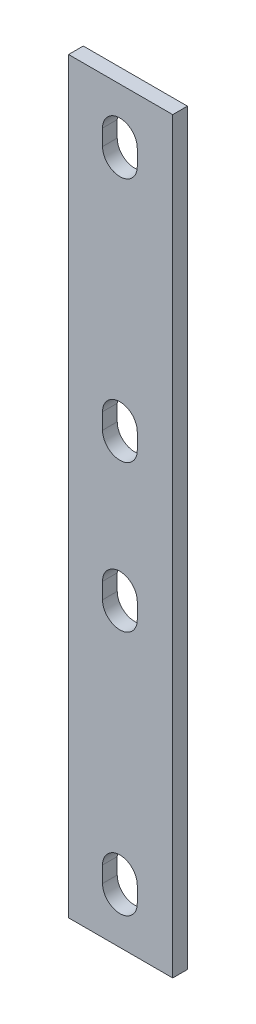
ISO-10303-21;
HEADER;
FILE_DESCRIPTION(('STEP AP214'),'2;1');
FILE_NAME('part.step','',(''),(''),'','','');
FILE_SCHEMA(('AUTOMOTIVE_DESIGN { 1 0 10303 214 1 1 1 1 }'));
ENDSEC;
DATA;
#1=APPLICATION_CONTEXT('core data for automotive mechanical design processes');
#2=APPLICATION_PROTOCOL_DEFINITION('international standard','automotive_design',2000,#1);
#3=PRODUCT_CONTEXT('',#1,'mechanical');
#4=PRODUCT('Part','Part','',(#3));
#5=PRODUCT_RELATED_PRODUCT_CATEGORY('part','',(#4));
#6=PRODUCT_DEFINITION_FORMATION('','',#4);
#7=PRODUCT_DEFINITION_CONTEXT('part definition',#1,'design');
#8=PRODUCT_DEFINITION('design','',#6,#7);
#9=PRODUCT_DEFINITION_SHAPE('','',#8);
#10=(LENGTH_UNIT() NAMED_UNIT(*) SI_UNIT(.MILLI.,.METRE.));
#11=(NAMED_UNIT(*) PLANE_ANGLE_UNIT() SI_UNIT($,.RADIAN.));
#12=(NAMED_UNIT(*) SI_UNIT($,.STERADIAN.) SOLID_ANGLE_UNIT());
#13=UNCERTAINTY_MEASURE_WITH_UNIT(LENGTH_MEASURE(1.E-05),#10,'distance_accuracy_value','');
#14=(GEOMETRIC_REPRESENTATION_CONTEXT(3) GLOBAL_UNCERTAINTY_ASSIGNED_CONTEXT((#13)) GLOBAL_UNIT_ASSIGNED_CONTEXT((#10,
#11,#12)) REPRESENTATION_CONTEXT('',''));
#15=CARTESIAN_POINT('',(0.,0.,0.));
#16=DIRECTION('',(0.,0.,1.));
#17=DIRECTION('',(1.,0.,0.));
#18=AXIS2_PLACEMENT_3D('',#15,#16,#17);
#19=CARTESIAN_POINT('',(0.,0.,5.5));
#20=DIRECTION('',(1.,0.,0.));
#21=DIRECTION('',(0.,1.,0.));
#22=AXIS2_PLACEMENT_3D('',#19,#20,#21);
#23=PLANE('',#22);
#24=DIRECTION('',(0.,-1.,0.));
#25=VECTOR('',#24,1.);
#26=CARTESIAN_POINT('',(0.,0.,0.));
#27=LINE('',#26,#25);
#28=CARTESIAN_POINT('',(0.,0.,0.));
#29=VERTEX_POINT('',#28);
#30=CARTESIAN_POINT('',(0.,-280.,0.));
#31=VERTEX_POINT('',#30);
#32=EDGE_CURVE('E258',#29,#31,#27,.T.);
#33=ORIENTED_EDGE('',*,*,#32,.T.);
#34=DIRECTION('',(0.,0.,-1.));
#35=VECTOR('',#34,1.);
#36=CARTESIAN_POINT('',(0.,-280.,5.5));
#37=LINE('',#36,#35);
#38=CARTESIAN_POINT('',(0.,-280.,5.5));
#39=VERTEX_POINT('',#38);
#40=EDGE_CURVE('E291',#39,#31,#37,.T.);
#41=ORIENTED_EDGE('',*,*,#40,.F.);
#42=DIRECTION('',(0.,-1.,0.));
#43=VECTOR('',#42,1.);
#44=CARTESIAN_POINT('',(0.,0.,5.5));
#45=LINE('',#44,#43);
#46=CARTESIAN_POINT('',(0.,0.,5.5));
#47=VERTEX_POINT('',#46);
#48=EDGE_CURVE('E265',#47,#39,#45,.T.);
#49=ORIENTED_EDGE('',*,*,#48,.F.);
#50=DIRECTION('',(0.,0.,-1.));
#51=VECTOR('',#50,1.);
#52=CARTESIAN_POINT('',(0.,0.,5.5));
#53=LINE('',#52,#51);
#54=EDGE_CURVE('E275',#47,#29,#53,.T.);
#55=ORIENTED_EDGE('',*,*,#54,.T.);
#56=EDGE_LOOP('',(#33,#41,#49,#55));
#57=FACE_BOUND('',#56,.T.);
#58=ADVANCED_FACE('F39',(#57),#23,.F.);
#59=CARTESIAN_POINT('',(0.,-280.,5.5));
#60=DIRECTION('',(0.,1.,0.));
#61=DIRECTION('',(0.,0.,1.));
#62=AXIS2_PLACEMENT_3D('',#59,#60,#61);
#63=PLANE('',#62);
#64=DIRECTION('',(1.,0.,0.));
#65=VECTOR('',#64,1.);
#66=CARTESIAN_POINT('',(0.,-280.,0.));
#67=LINE('',#66,#65);
#68=CARTESIAN_POINT('',(39.,-280.,0.));
#69=VERTEX_POINT('',#68);
#70=EDGE_CURVE('E278',#31,#69,#67,.T.);
#71=ORIENTED_EDGE('',*,*,#70,.T.);
#72=DIRECTION('',(0.,0.,-1.));
#73=VECTOR('',#72,1.);
#74=CARTESIAN_POINT('',(39.,-280.,5.5));
#75=LINE('',#74,#73);
#76=CARTESIAN_POINT('',(39.,-280.,5.5));
#77=VERTEX_POINT('',#76);
#78=EDGE_CURVE('E288',#77,#69,#75,.T.);
#79=ORIENTED_EDGE('',*,*,#78,.F.);
#80=DIRECTION('',(1.,0.,0.));
#81=VECTOR('',#80,1.);
#82=CARTESIAN_POINT('',(0.,-280.,5.5));
#83=LINE('',#82,#81);
#84=EDGE_CURVE('E268',#39,#77,#83,.T.);
#85=ORIENTED_EDGE('',*,*,#84,.F.);
#86=ORIENTED_EDGE('',*,*,#40,.T.);
#87=EDGE_LOOP('',(#71,#79,#85,#86));
#88=FACE_BOUND('',#87,.T.);
#89=ADVANCED_FACE('F365',(#88),#63,.F.);
#90=CARTESIAN_POINT('',(39.,0.,5.5));
#91=DIRECTION('',(-1.,0.,0.));
#92=DIRECTION('',(0.,-1.,0.));
#93=AXIS2_PLACEMENT_3D('',#90,#91,#92);
#94=PLANE('',#93);
#95=DIRECTION('',(0.,1.,0.));
#96=VECTOR('',#95,1.);
#97=CARTESIAN_POINT('',(39.,0.,0.));
#98=LINE('',#97,#96);
#99=CARTESIAN_POINT('',(39.,0.,0.));
#100=VERTEX_POINT('',#99);
#101=EDGE_CURVE('E280',#69,#100,#98,.T.);
#102=ORIENTED_EDGE('',*,*,#101,.T.);
#103=DIRECTION('',(0.,0.,-1.));
#104=VECTOR('',#103,1.);
#105=CARTESIAN_POINT('',(39.,0.,5.5));
#106=LINE('',#105,#104);
#107=CARTESIAN_POINT('',(39.,0.,5.5));
#108=VERTEX_POINT('',#107);
#109=EDGE_CURVE('E285',#108,#100,#106,.T.);
#110=ORIENTED_EDGE('',*,*,#109,.F.);
#111=DIRECTION('',(0.,1.,0.));
#112=VECTOR('',#111,1.);
#113=CARTESIAN_POINT('',(39.,0.,5.5));
#114=LINE('',#113,#112);
#115=EDGE_CURVE('E271',#77,#108,#114,.T.);
#116=ORIENTED_EDGE('',*,*,#115,.F.);
#117=ORIENTED_EDGE('',*,*,#78,.T.);
#118=EDGE_LOOP('',(#102,#110,#116,#117));
#119=FACE_BOUND('',#118,.T.);
#120=ADVANCED_FACE('F370',(#119),#94,.F.);
#121=CARTESIAN_POINT('',(0.,0.,5.5));
#122=DIRECTION('',(0.,-1.,0.));
#123=DIRECTION('',(0.,0.,-1.));
#124=AXIS2_PLACEMENT_3D('',#121,#122,#123);
#125=PLANE('',#124);
#126=DIRECTION('',(-1.,0.,0.));
#127=VECTOR('',#126,1.);
#128=CARTESIAN_POINT('',(0.,0.,0.));
#129=LINE('',#128,#127);
#130=EDGE_CURVE('E269',#100,#29,#129,.T.);
#131=ORIENTED_EDGE('',*,*,#130,.T.);
#132=ORIENTED_EDGE('',*,*,#54,.F.);
#133=DIRECTION('',(-1.,0.,0.));
#134=VECTOR('',#133,1.);
#135=CARTESIAN_POINT('',(0.,0.,5.5));
#136=LINE('',#135,#134);
#137=EDGE_CURVE('E273',#108,#47,#136,.T.);
#138=ORIENTED_EDGE('',*,*,#137,.F.);
#139=ORIENTED_EDGE('',*,*,#109,.T.);
#140=EDGE_LOOP('',(#131,#132,#138,#139));
#141=FACE_BOUND('',#140,.T.);
#142=ADVANCED_FACE('F385',(#141),#125,.F.);
#143=CARTESIAN_POINT('',(0.,0.,5.5));
#144=DIRECTION('',(0.,0.,1.));
#145=DIRECTION('',(1.,0.,0.));
#146=AXIS2_PLACEMENT_3D('',#143,#144,#145);
#147=PLANE('',#146);
#148=CARTESIAN_POINT('',(19.2172600014123,-256.5,5.5));
#149=DIRECTION('',(0.,0.,1.));
#150=DIRECTION('',(1.,0.,0.));
#151=AXIS2_PLACEMENT_3D('',#148,#149,#150);
#152=CIRCLE('',#151,6.50000000000001);
#153=CARTESIAN_POINT('',(25.7172600014123,-256.5,5.5));
#154=VERTEX_POINT('',#153);
#155=CARTESIAN_POINT('',(12.7172600014123,-256.5,5.5));
#156=VERTEX_POINT('',#155);
#157=EDGE_CURVE('E53',#154,#156,#152,.T.);
#158=ORIENTED_EDGE('',*,*,#157,.F.);
#159=DIRECTION('',(0.,1.,0.));
#160=VECTOR('',#159,1.);
#161=CARTESIAN_POINT('',(25.7172600014123,-256.5,5.5));
#162=LINE('',#161,#160);
#163=CARTESIAN_POINT('',(25.7172600014123,-262.5,5.5));
#164=VERTEX_POINT('',#163);
#165=EDGE_CURVE('E231',#164,#154,#162,.T.);
#166=ORIENTED_EDGE('',*,*,#165,.F.);
#167=CARTESIAN_POINT('',(19.2172600014123,-262.5,5.5));
#168=DIRECTION('',(0.,0.,1.));
#169=DIRECTION('',(1.,0.,0.));
#170=AXIS2_PLACEMENT_3D('',#167,#168,#169);
#171=CIRCLE('',#170,6.50000000000001);
#172=CARTESIAN_POINT('',(12.7172600014123,-262.5,5.5));
#173=VERTEX_POINT('',#172);
#174=EDGE_CURVE('E240',#173,#164,#171,.T.);
#175=ORIENTED_EDGE('',*,*,#174,.F.);
#176=DIRECTION('',(0.,-1.,0.));
#177=VECTOR('',#176,1.);
#178=CARTESIAN_POINT('',(12.7172600014123,-256.5,5.5));
#179=LINE('',#178,#177);
#180=EDGE_CURVE('E243',#156,#173,#179,.T.);
#181=ORIENTED_EDGE('',*,*,#180,.F.);
#182=EDGE_LOOP('',(#158,#166,#175,#181));
#183=FACE_BOUND('',#182,.T.);
#184=CARTESIAN_POINT('',(19.2172600014123,-23.5,5.5));
#185=DIRECTION('',(0.,0.,1.));
#186=DIRECTION('',(-1.,0.,0.));
#187=AXIS2_PLACEMENT_3D('',#184,#185,#186);
#188=CIRCLE('',#187,6.50000000000001);
#189=CARTESIAN_POINT('',(12.7172600014123,-23.5,5.5));
#190=VERTEX_POINT('',#189);
#191=CARTESIAN_POINT('',(25.7172600014123,-23.5,5.5));
#192=VERTEX_POINT('',#191);
#193=EDGE_CURVE('E61',#190,#192,#188,.T.);
#194=ORIENTED_EDGE('',*,*,#193,.F.);
#195=DIRECTION('',(0.,-1.,0.));
#196=VECTOR('',#195,1.);
#197=CARTESIAN_POINT('',(12.7172600014123,-23.5,5.5));
#198=LINE('',#197,#196);
#199=CARTESIAN_POINT('',(12.7172600014123,-17.5,5.5));
#200=VERTEX_POINT('',#199);
#201=EDGE_CURVE('E213',#200,#190,#198,.T.);
#202=ORIENTED_EDGE('',*,*,#201,.F.);
#203=CARTESIAN_POINT('',(19.2172600014123,-17.5,5.5));
#204=DIRECTION('',(0.,0.,1.));
#205=DIRECTION('',(-1.,0.,0.));
#206=AXIS2_PLACEMENT_3D('',#203,#204,#205);
#207=CIRCLE('',#206,6.50000000000001);
#208=CARTESIAN_POINT('',(25.7172600014123,-17.5,5.5));
#209=VERTEX_POINT('',#208);
#210=EDGE_CURVE('E222',#209,#200,#207,.T.);
#211=ORIENTED_EDGE('',*,*,#210,.F.);
#212=DIRECTION('',(0.,1.,0.));
#213=VECTOR('',#212,1.);
#214=CARTESIAN_POINT('',(25.7172600014123,-23.5,5.5));
#215=LINE('',#214,#213);
#216=EDGE_CURVE('E225',#192,#209,#215,.T.);
#217=ORIENTED_EDGE('',*,*,#216,.F.);
#218=EDGE_LOOP('',(#194,#202,#211,#217));
#219=FACE_BOUND('',#218,.T.);
#220=CARTESIAN_POINT('',(19.2172600014123,-109.5,5.5));
#221=DIRECTION('',(0.,0.,1.));
#222=DIRECTION('',(1.,0.,0.));
#223=AXIS2_PLACEMENT_3D('',#220,#221,#222);
#224=CIRCLE('',#223,6.50000000000001);
#225=CARTESIAN_POINT('',(25.7172600014123,-109.5,5.5));
#226=VERTEX_POINT('',#225);
#227=CARTESIAN_POINT('',(12.7172600014123,-109.5,5.5));
#228=VERTEX_POINT('',#227);
#229=EDGE_CURVE('E181',#226,#228,#224,.T.);
#230=ORIENTED_EDGE('',*,*,#229,.F.);
#231=DIRECTION('',(0.,1.,0.));
#232=VECTOR('',#231,1.);
#233=CARTESIAN_POINT('',(25.7172600014123,-109.5,5.5));
#234=LINE('',#233,#232);
#235=CARTESIAN_POINT('',(25.7172600014123,-115.5,5.5));
#236=VERTEX_POINT('',#235);
#237=EDGE_CURVE('E190',#236,#226,#234,.T.);
#238=ORIENTED_EDGE('',*,*,#237,.F.);
#239=CARTESIAN_POINT('',(19.2172600014123,-115.5,5.5));
#240=DIRECTION('',(0.,0.,1.));
#241=DIRECTION('',(1.,0.,0.));
#242=AXIS2_PLACEMENT_3D('',#239,#240,#241);
#243=CIRCLE('',#242,6.50000000000001);
#244=CARTESIAN_POINT('',(12.7172600014123,-115.5,5.5));
#245=VERTEX_POINT('',#244);
#246=EDGE_CURVE('E196',#245,#236,#243,.T.);
#247=ORIENTED_EDGE('',*,*,#246,.F.);
#248=DIRECTION('',(0.,-1.,0.));
#249=VECTOR('',#248,1.);
#250=CARTESIAN_POINT('',(12.7172600014123,-109.5,5.5));
#251=LINE('',#250,#249);
#252=EDGE_CURVE('E203',#228,#245,#251,.T.);
#253=ORIENTED_EDGE('',*,*,#252,.F.);
#254=EDGE_LOOP('',(#230,#238,#247,#253));
#255=FACE_BOUND('',#254,.T.);
#256=CARTESIAN_POINT('',(19.2172600014123,-170.5,5.5));
#257=DIRECTION('',(0.,0.,1.));
#258=DIRECTION('',(-1.,0.,0.));
#259=AXIS2_PLACEMENT_3D('',#256,#257,#258);
#260=CIRCLE('',#259,6.50000000000001);
#261=CARTESIAN_POINT('',(12.7172600014123,-170.5,5.5));
#262=VERTEX_POINT('',#261);
#263=CARTESIAN_POINT('',(25.7172600014123,-170.5,5.5));
#264=VERTEX_POINT('',#263);
#265=EDGE_CURVE('E204',#262,#264,#260,.T.);
#266=ORIENTED_EDGE('',*,*,#265,.F.);
#267=DIRECTION('',(0.,-1.,0.));
#268=VECTOR('',#267,1.);
#269=CARTESIAN_POINT('',(12.7172600014123,-170.5,5.5));
#270=LINE('',#269,#268);
#271=CARTESIAN_POINT('',(12.7172600014123,-164.5,5.5));
#272=VERTEX_POINT('',#271);
#273=EDGE_CURVE('E252',#272,#262,#270,.T.);
#274=ORIENTED_EDGE('',*,*,#273,.F.);
#275=CARTESIAN_POINT('',(19.2172600014123,-164.5,5.5));
#276=DIRECTION('',(0.,0.,1.));
#277=DIRECTION('',(-1.,0.,0.));
#278=AXIS2_PLACEMENT_3D('',#275,#276,#277);
#279=CIRCLE('',#278,6.50000000000001);
#280=CARTESIAN_POINT('',(25.7172600014123,-164.5,5.5));
#281=VERTEX_POINT('',#280);
#282=EDGE_CURVE('E249',#281,#272,#279,.T.);
#283=ORIENTED_EDGE('',*,*,#282,.F.);
#284=DIRECTION('',(0.,1.,0.));
#285=VECTOR('',#284,1.);
#286=CARTESIAN_POINT('',(25.7172600014123,-170.5,5.5));
#287=LINE('',#286,#285);
#288=EDGE_CURVE('E206',#264,#281,#287,.T.);
#289=ORIENTED_EDGE('',*,*,#288,.F.);
#290=EDGE_LOOP('',(#266,#274,#283,#289));
#291=FACE_BOUND('',#290,.T.);
#292=ORIENTED_EDGE('',*,*,#48,.T.);
#293=ORIENTED_EDGE('',*,*,#84,.T.);
#294=ORIENTED_EDGE('',*,*,#115,.T.);
#295=ORIENTED_EDGE('',*,*,#137,.T.);
#296=EDGE_LOOP('',(#292,#293,#294,#295));
#297=FACE_BOUND('',#296,.T.);
#298=ADVANCED_FACE('F200',(#183,#219,#255,#291,#297),#147,.T.);
#299=CARTESIAN_POINT('',(0.,0.,0.));
#300=DIRECTION('',(0.,0.,1.));
#301=DIRECTION('',(1.,0.,0.));
#302=AXIS2_PLACEMENT_3D('',#299,#300,#301);
#303=PLANE('',#302);
#304=DIRECTION('',(0.,1.,0.));
#305=VECTOR('',#304,1.);
#306=CARTESIAN_POINT('',(25.7172600014123,0.,0.));
#307=LINE('',#306,#305);
#308=CARTESIAN_POINT('',(25.7172600014123,-262.5,0.));
#309=VERTEX_POINT('',#308);
#310=CARTESIAN_POINT('',(25.7172600014123,-256.5,0.));
#311=VERTEX_POINT('',#310);
#312=EDGE_CURVE('E46',#309,#311,#307,.T.);
#313=ORIENTED_EDGE('',*,*,#312,.T.);
#314=CARTESIAN_POINT('',(19.2172600014123,-256.5,0.));
#315=DIRECTION('',(0.,0.,1.));
#316=DIRECTION('',(1.,0.,0.));
#317=AXIS2_PLACEMENT_3D('',#314,#315,#316);
#318=CIRCLE('',#317,6.50000000000001);
#319=CARTESIAN_POINT('',(12.7172600014123,-256.5,0.));
#320=VERTEX_POINT('',#319);
#321=EDGE_CURVE('E11',#311,#320,#318,.T.);
#322=ORIENTED_EDGE('',*,*,#321,.T.);
#323=DIRECTION('',(0.,-1.,0.));
#324=VECTOR('',#323,1.);
#325=CARTESIAN_POINT('',(12.7172600014123,0.,0.));
#326=LINE('',#325,#324);
#327=CARTESIAN_POINT('',(12.7172600014123,-262.5,0.));
#328=VERTEX_POINT('',#327);
#329=EDGE_CURVE('E327',#320,#328,#326,.T.);
#330=ORIENTED_EDGE('',*,*,#329,.T.);
#331=CARTESIAN_POINT('',(19.2172600014123,-262.5,0.));
#332=DIRECTION('',(0.,0.,1.));
#333=DIRECTION('',(1.,0.,0.));
#334=AXIS2_PLACEMENT_3D('',#331,#332,#333);
#335=CIRCLE('',#334,6.50000000000001);
#336=EDGE_CURVE('E330',#328,#309,#335,.T.);
#337=ORIENTED_EDGE('',*,*,#336,.T.);
#338=EDGE_LOOP('',(#313,#322,#330,#337));
#339=FACE_BOUND('',#338,.T.);
#340=DIRECTION('',(0.,-1.,0.));
#341=VECTOR('',#340,1.);
#342=CARTESIAN_POINT('',(12.7172600014123,0.,0.));
#343=LINE('',#342,#341);
#344=CARTESIAN_POINT('',(12.7172600014123,-17.5,0.));
#345=VERTEX_POINT('',#344);
#346=CARTESIAN_POINT('',(12.7172600014123,-23.5,0.));
#347=VERTEX_POINT('',#346);
#348=EDGE_CURVE('E321',#345,#347,#343,.T.);
#349=ORIENTED_EDGE('',*,*,#348,.T.);
#350=CARTESIAN_POINT('',(19.2172600014123,-23.5,0.));
#351=DIRECTION('',(0.,0.,1.));
#352=DIRECTION('',(1.,0.,0.));
#353=AXIS2_PLACEMENT_3D('',#350,#351,#352);
#354=CIRCLE('',#353,6.50000000000001);
#355=CARTESIAN_POINT('',(25.7172600014123,-23.5,0.));
#356=VERTEX_POINT('',#355);
#357=EDGE_CURVE('E324',#347,#356,#354,.T.);
#358=ORIENTED_EDGE('',*,*,#357,.T.);
#359=DIRECTION('',(0.,1.,0.));
#360=VECTOR('',#359,1.);
#361=CARTESIAN_POINT('',(25.7172600014123,0.,0.));
#362=LINE('',#361,#360);
#363=CARTESIAN_POINT('',(25.7172600014123,-17.5,0.));
#364=VERTEX_POINT('',#363);
#365=EDGE_CURVE('E315',#356,#364,#362,.T.);
#366=ORIENTED_EDGE('',*,*,#365,.T.);
#367=CARTESIAN_POINT('',(19.2172600014123,-17.5,0.));
#368=DIRECTION('',(0.,0.,1.));
#369=DIRECTION('',(1.,0.,0.));
#370=AXIS2_PLACEMENT_3D('',#367,#368,#369);
#371=CIRCLE('',#370,6.50000000000001);
#372=EDGE_CURVE('E318',#364,#345,#371,.T.);
#373=ORIENTED_EDGE('',*,*,#372,.T.);
#374=EDGE_LOOP('',(#349,#358,#366,#373));
#375=FACE_BOUND('',#374,.T.);
#376=DIRECTION('',(0.,1.,0.));
#377=VECTOR('',#376,1.);
#378=CARTESIAN_POINT('',(25.7172600014123,0.,0.));
#379=LINE('',#378,#377);
#380=CARTESIAN_POINT('',(25.7172600014123,-115.5,0.));
#381=VERTEX_POINT('',#380);
#382=CARTESIAN_POINT('',(25.7172600014123,-109.5,0.));
#383=VERTEX_POINT('',#382);
#384=EDGE_CURVE('E312',#381,#383,#379,.T.);
#385=ORIENTED_EDGE('',*,*,#384,.T.);
#386=CARTESIAN_POINT('',(19.2172600014123,-109.5,0.));
#387=DIRECTION('',(0.,0.,1.));
#388=DIRECTION('',(1.,0.,0.));
#389=AXIS2_PLACEMENT_3D('',#386,#387,#388);
#390=CIRCLE('',#389,6.50000000000001);
#391=CARTESIAN_POINT('',(12.7172600014123,-109.5,0.));
#392=VERTEX_POINT('',#391);
#393=EDGE_CURVE('E184',#383,#392,#390,.T.);
#394=ORIENTED_EDGE('',*,*,#393,.T.);
#395=DIRECTION('',(0.,-1.,0.));
#396=VECTOR('',#395,1.);
#397=CARTESIAN_POINT('',(12.7172600014123,0.,0.));
#398=LINE('',#397,#396);
#399=CARTESIAN_POINT('',(12.7172600014123,-115.5,0.));
#400=VERTEX_POINT('',#399);
#401=EDGE_CURVE('E306',#392,#400,#398,.T.);
#402=ORIENTED_EDGE('',*,*,#401,.T.);
#403=CARTESIAN_POINT('',(19.2172600014123,-115.5,0.));
#404=DIRECTION('',(0.,0.,1.));
#405=DIRECTION('',(1.,0.,0.));
#406=AXIS2_PLACEMENT_3D('',#403,#404,#405);
#407=CIRCLE('',#406,6.50000000000001);
#408=EDGE_CURVE('E309',#400,#381,#407,.T.);
#409=ORIENTED_EDGE('',*,*,#408,.T.);
#410=EDGE_LOOP('',(#385,#394,#402,#409));
#411=FACE_BOUND('',#410,.T.);
#412=DIRECTION('',(0.,-1.,0.));
#413=VECTOR('',#412,1.);
#414=CARTESIAN_POINT('',(12.7172600014123,0.,0.));
#415=LINE('',#414,#413);
#416=CARTESIAN_POINT('',(12.7172600014123,-164.5,0.));
#417=VERTEX_POINT('',#416);
#418=CARTESIAN_POINT('',(12.7172600014123,-170.5,0.));
#419=VERTEX_POINT('',#418);
#420=EDGE_CURVE('E300',#417,#419,#415,.T.);
#421=ORIENTED_EDGE('',*,*,#420,.T.);
#422=CARTESIAN_POINT('',(19.2172600014123,-170.5,0.));
#423=DIRECTION('',(0.,0.,1.));
#424=DIRECTION('',(1.,0.,0.));
#425=AXIS2_PLACEMENT_3D('',#422,#423,#424);
#426=CIRCLE('',#425,6.50000000000001);
#427=CARTESIAN_POINT('',(25.7172600014123,-170.5,0.));
#428=VERTEX_POINT('',#427);
#429=EDGE_CURVE('E303',#419,#428,#426,.T.);
#430=ORIENTED_EDGE('',*,*,#429,.T.);
#431=DIRECTION('',(0.,1.,0.));
#432=VECTOR('',#431,1.);
#433=CARTESIAN_POINT('',(25.7172600014123,0.,0.));
#434=LINE('',#433,#432);
#435=CARTESIAN_POINT('',(25.7172600014123,-164.5,0.));
#436=VERTEX_POINT('',#435);
#437=EDGE_CURVE('E294',#428,#436,#434,.T.);
#438=ORIENTED_EDGE('',*,*,#437,.T.);
#439=CARTESIAN_POINT('',(19.2172600014123,-164.5,0.));
#440=DIRECTION('',(0.,0.,1.));
#441=DIRECTION('',(1.,0.,0.));
#442=AXIS2_PLACEMENT_3D('',#439,#440,#441);
#443=CIRCLE('',#442,6.50000000000001);
#444=EDGE_CURVE('E297',#436,#417,#443,.T.);
#445=ORIENTED_EDGE('',*,*,#444,.T.);
#446=EDGE_LOOP('',(#421,#430,#438,#445));
#447=FACE_BOUND('',#446,.T.);
#448=ORIENTED_EDGE('',*,*,#32,.F.);
#449=ORIENTED_EDGE('',*,*,#130,.F.);
#450=ORIENTED_EDGE('',*,*,#101,.F.);
#451=ORIENTED_EDGE('',*,*,#70,.F.);
#452=EDGE_LOOP('',(#448,#449,#450,#451));
#453=FACE_BOUND('',#452,.T.);
#454=ADVANCED_FACE('F334',(#339,#375,#411,#447,#453),#303,.F.);
#455=CARTESIAN_POINT('',(19.2172600014123,-170.5,-0.5));
#456=DIRECTION('',(0.,0.,1.));
#457=DIRECTION('',(1.,0.,0.));
#458=AXIS2_PLACEMENT_3D('',#455,#456,#457);
#459=CYLINDRICAL_SURFACE('',#458,6.50000000000001);
#460=DIRECTION('',(0.,0.,1.));
#461=VECTOR('',#460,1.);
#462=CARTESIAN_POINT('',(12.7172600014123,-170.5,-0.5));
#463=LINE('',#462,#461);
#464=EDGE_CURVE('E256',#419,#262,#463,.T.);
#465=ORIENTED_EDGE('',*,*,#464,.T.);
#466=ORIENTED_EDGE('',*,*,#265,.T.);
#467=DIRECTION('',(0.,0.,1.));
#468=VECTOR('',#467,1.);
#469=CARTESIAN_POINT('',(25.7172600014123,-170.5,-0.5));
#470=LINE('',#469,#468);
#471=EDGE_CURVE('E255',#428,#264,#470,.T.);
#472=ORIENTED_EDGE('',*,*,#471,.F.);
#473=ORIENTED_EDGE('',*,*,#429,.F.);
#474=EDGE_LOOP('',(#465,#466,#472,#473));
#475=FACE_BOUND('',#474,.T.);
#476=ADVANCED_FACE('F396',(#475),#459,.F.);
#477=CARTESIAN_POINT('',(12.7172600014123,-170.5,-0.5));
#478=DIRECTION('',(-1.,0.,0.));
#479=DIRECTION('',(0.,-1.,0.));
#480=AXIS2_PLACEMENT_3D('',#477,#478,#479);
#481=PLANE('',#480);
#482=DIRECTION('',(0.,0.,1.));
#483=VECTOR('',#482,1.);
#484=CARTESIAN_POINT('',(12.7172600014123,-164.5,-0.5));
#485=LINE('',#484,#483);
#486=EDGE_CURVE('E259',#417,#272,#485,.T.);
#487=ORIENTED_EDGE('',*,*,#486,.T.);
#488=ORIENTED_EDGE('',*,*,#273,.T.);
#489=ORIENTED_EDGE('',*,*,#464,.F.);
#490=ORIENTED_EDGE('',*,*,#420,.F.);
#491=EDGE_LOOP('',(#487,#488,#489,#490));
#492=FACE_BOUND('',#491,.T.);
#493=ADVANCED_FACE('F401',(#492),#481,.F.);
#494=CARTESIAN_POINT('',(19.2172600014123,-164.5,-0.5));
#495=DIRECTION('',(0.,0.,1.));
#496=DIRECTION('',(1.,0.,0.));
#497=AXIS2_PLACEMENT_3D('',#494,#495,#496);
#498=CYLINDRICAL_SURFACE('',#497,6.50000000000001);
#499=DIRECTION('',(0.,0.,1.));
#500=VECTOR('',#499,1.);
#501=CARTESIAN_POINT('',(25.7172600014123,-164.5,-0.5));
#502=LINE('',#501,#500);
#503=EDGE_CURVE('E261',#436,#281,#502,.T.);
#504=ORIENTED_EDGE('',*,*,#503,.T.);
#505=ORIENTED_EDGE('',*,*,#282,.T.);
#506=ORIENTED_EDGE('',*,*,#486,.F.);
#507=ORIENTED_EDGE('',*,*,#444,.F.);
#508=EDGE_LOOP('',(#504,#505,#506,#507));
#509=FACE_BOUND('',#508,.T.);
#510=ADVANCED_FACE('F406',(#509),#498,.F.);
#511=CARTESIAN_POINT('',(25.7172600014123,-170.5,-0.5));
#512=DIRECTION('',(1.,0.,0.));
#513=DIRECTION('',(0.,0.,-1.));
#514=AXIS2_PLACEMENT_3D('',#511,#512,#513);
#515=PLANE('',#514);
#516=ORIENTED_EDGE('',*,*,#471,.T.);
#517=ORIENTED_EDGE('',*,*,#288,.T.);
#518=ORIENTED_EDGE('',*,*,#503,.F.);
#519=ORIENTED_EDGE('',*,*,#437,.F.);
#520=EDGE_LOOP('',(#516,#517,#518,#519));
#521=FACE_BOUND('',#520,.T.);
#522=ADVANCED_FACE('F403',(#521),#515,.F.);
#523=CARTESIAN_POINT('',(19.2172600014123,-109.5,-0.5));
#524=DIRECTION('',(0.,0.,1.));
#525=DIRECTION('',(1.,0.,0.));
#526=AXIS2_PLACEMENT_3D('',#523,#524,#525);
#527=CYLINDRICAL_SURFACE('',#526,6.50000000000001);
#528=DIRECTION('',(0.,0.,1.));
#529=VECTOR('',#528,1.);
#530=CARTESIAN_POINT('',(25.7172600014123,-109.5,-0.5));
#531=LINE('',#530,#529);
#532=EDGE_CURVE('E176',#383,#226,#531,.T.);
#533=ORIENTED_EDGE('',*,*,#532,.T.);
#534=ORIENTED_EDGE('',*,*,#229,.T.);
#535=DIRECTION('',(0.,0.,1.));
#536=VECTOR('',#535,1.);
#537=CARTESIAN_POINT('',(12.7172600014123,-109.5,-0.5));
#538=LINE('',#537,#536);
#539=EDGE_CURVE('E197',#392,#228,#538,.T.);
#540=ORIENTED_EDGE('',*,*,#539,.F.);
#541=ORIENTED_EDGE('',*,*,#393,.F.);
#542=EDGE_LOOP('',(#533,#534,#540,#541));
#543=FACE_BOUND('',#542,.T.);
#544=ADVANCED_FACE('F178',(#543),#527,.F.);
#545=CARTESIAN_POINT('',(25.7172600014123,-109.5,-0.5));
#546=DIRECTION('',(1.,0.,0.));
#547=DIRECTION('',(0.,0.,-1.));
#548=AXIS2_PLACEMENT_3D('',#545,#546,#547);
#549=PLANE('',#548);
#550=DIRECTION('',(0.,0.,1.));
#551=VECTOR('',#550,1.);
#552=CARTESIAN_POINT('',(25.7172600014123,-115.5,-0.5));
#553=LINE('',#552,#551);
#554=EDGE_CURVE('E187',#381,#236,#553,.T.);
#555=ORIENTED_EDGE('',*,*,#554,.T.);
#556=ORIENTED_EDGE('',*,*,#237,.T.);
#557=ORIENTED_EDGE('',*,*,#532,.F.);
#558=ORIENTED_EDGE('',*,*,#384,.F.);
#559=EDGE_LOOP('',(#555,#556,#557,#558));
#560=FACE_BOUND('',#559,.T.);
#561=ADVANCED_FACE('F191',(#560),#549,.F.);
#562=CARTESIAN_POINT('',(19.2172600014123,-115.5,-0.5));
#563=DIRECTION('',(0.,0.,1.));
#564=DIRECTION('',(1.,0.,0.));
#565=AXIS2_PLACEMENT_3D('',#562,#563,#564);
#566=CYLINDRICAL_SURFACE('',#565,6.50000000000001);
#567=DIRECTION('',(0.,0.,1.));
#568=VECTOR('',#567,1.);
#569=CARTESIAN_POINT('',(12.7172600014123,-115.5,-0.5));
#570=LINE('',#569,#568);
#571=EDGE_CURVE('E562',#400,#245,#570,.T.);
#572=ORIENTED_EDGE('',*,*,#571,.T.);
#573=ORIENTED_EDGE('',*,*,#246,.T.);
#574=ORIENTED_EDGE('',*,*,#554,.F.);
#575=ORIENTED_EDGE('',*,*,#408,.F.);
#576=EDGE_LOOP('',(#572,#573,#574,#575));
#577=FACE_BOUND('',#576,.T.);
#578=ADVANCED_FACE('F476',(#577),#566,.F.);
#579=CARTESIAN_POINT('',(12.7172600014123,-109.5,-0.5));
#580=DIRECTION('',(-1.,0.,0.));
#581=DIRECTION('',(0.,-1.,0.));
#582=AXIS2_PLACEMENT_3D('',#579,#580,#581);
#583=PLANE('',#582);
#584=ORIENTED_EDGE('',*,*,#539,.T.);
#585=ORIENTED_EDGE('',*,*,#252,.T.);
#586=ORIENTED_EDGE('',*,*,#571,.F.);
#587=ORIENTED_EDGE('',*,*,#401,.F.);
#588=EDGE_LOOP('',(#584,#585,#586,#587));
#589=FACE_BOUND('',#588,.T.);
#590=ADVANCED_FACE('F467',(#589),#583,.F.);
#591=CARTESIAN_POINT('',(19.2172600014123,-23.5,-0.5));
#592=DIRECTION('',(0.,0.,1.));
#593=DIRECTION('',(1.,0.,0.));
#594=AXIS2_PLACEMENT_3D('',#591,#592,#593);
#595=CYLINDRICAL_SURFACE('',#594,6.50000000000001);
#596=DIRECTION('',(0.,0.,1.));
#597=VECTOR('',#596,1.);
#598=CARTESIAN_POINT('',(12.7172600014123,-23.5,-0.5));
#599=LINE('',#598,#597);
#600=EDGE_CURVE('E218',#347,#190,#599,.T.);
#601=ORIENTED_EDGE('',*,*,#600,.T.);
#602=ORIENTED_EDGE('',*,*,#193,.T.);
#603=DIRECTION('',(0.,0.,1.));
#604=VECTOR('',#603,1.);
#605=CARTESIAN_POINT('',(25.7172600014123,-23.5,-0.5));
#606=LINE('',#605,#604);
#607=EDGE_CURVE('E211',#356,#192,#606,.T.);
#608=ORIENTED_EDGE('',*,*,#607,.F.);
#609=ORIENTED_EDGE('',*,*,#357,.F.);
#610=EDGE_LOOP('',(#601,#602,#608,#609));
#611=FACE_BOUND('',#610,.T.);
#612=ADVANCED_FACE('F458',(#611),#595,.F.);
#613=CARTESIAN_POINT('',(12.7172600014123,-23.5,-0.5));
#614=DIRECTION('',(-1.,0.,0.));
#615=DIRECTION('',(0.,0.,1.));
#616=AXIS2_PLACEMENT_3D('',#613,#614,#615);
#617=PLANE('',#616);
#618=DIRECTION('',(0.,0.,1.));
#619=VECTOR('',#618,1.);
#620=CARTESIAN_POINT('',(12.7172600014123,-17.5,-0.5));
#621=LINE('',#620,#619);
#622=EDGE_CURVE('E216',#345,#200,#621,.T.);
#623=ORIENTED_EDGE('',*,*,#622,.T.);
#624=ORIENTED_EDGE('',*,*,#201,.T.);
#625=ORIENTED_EDGE('',*,*,#600,.F.);
#626=ORIENTED_EDGE('',*,*,#348,.F.);
#627=EDGE_LOOP('',(#623,#624,#625,#626));
#628=FACE_BOUND('',#627,.T.);
#629=ADVANCED_FACE('F448',(#628),#617,.F.);
#630=CARTESIAN_POINT('',(19.2172600014123,-17.5,-0.5));
#631=DIRECTION('',(0.,0.,1.));
#632=DIRECTION('',(1.,0.,0.));
#633=AXIS2_PLACEMENT_3D('',#630,#631,#632);
#634=CYLINDRICAL_SURFACE('',#633,6.50000000000001);
#635=DIRECTION('',(0.,0.,1.));
#636=VECTOR('',#635,1.);
#637=CARTESIAN_POINT('',(25.7172600014123,-17.5,-0.5));
#638=LINE('',#637,#636);
#639=EDGE_CURVE('E214',#364,#209,#638,.T.);
#640=ORIENTED_EDGE('',*,*,#639,.T.);
#641=ORIENTED_EDGE('',*,*,#210,.T.);
#642=ORIENTED_EDGE('',*,*,#622,.F.);
#643=ORIENTED_EDGE('',*,*,#372,.F.);
#644=EDGE_LOOP('',(#640,#641,#642,#643));
#645=FACE_BOUND('',#644,.T.);
#646=ADVANCED_FACE('F359',(#645),#634,.F.);
#647=CARTESIAN_POINT('',(25.7172600014123,-23.5,-0.5));
#648=DIRECTION('',(1.,0.,0.));
#649=DIRECTION('',(0.,0.,-1.));
#650=AXIS2_PLACEMENT_3D('',#647,#648,#649);
#651=PLANE('',#650);
#652=ORIENTED_EDGE('',*,*,#607,.T.);
#653=ORIENTED_EDGE('',*,*,#216,.T.);
#654=ORIENTED_EDGE('',*,*,#639,.F.);
#655=ORIENTED_EDGE('',*,*,#365,.F.);
#656=EDGE_LOOP('',(#652,#653,#654,#655));
#657=FACE_BOUND('',#656,.T.);
#658=ADVANCED_FACE('F352',(#657),#651,.F.);
#659=CARTESIAN_POINT('',(19.2172600014123,-256.5,-0.5));
#660=DIRECTION('',(0.,0.,1.));
#661=DIRECTION('',(1.,0.,0.));
#662=AXIS2_PLACEMENT_3D('',#659,#660,#661);
#663=CYLINDRICAL_SURFACE('',#662,6.50000000000001);
#664=DIRECTION('',(0.,0.,1.));
#665=VECTOR('',#664,1.);
#666=CARTESIAN_POINT('',(25.7172600014123,-256.5,-0.5));
#667=LINE('',#666,#665);
#668=EDGE_CURVE('E236',#311,#154,#667,.T.);
#669=ORIENTED_EDGE('',*,*,#668,.T.);
#670=ORIENTED_EDGE('',*,*,#157,.T.);
#671=DIRECTION('',(0.,0.,1.));
#672=VECTOR('',#671,1.);
#673=CARTESIAN_POINT('',(12.7172600014123,-256.5,-0.5));
#674=LINE('',#673,#672);
#675=EDGE_CURVE('E229',#320,#156,#674,.T.);
#676=ORIENTED_EDGE('',*,*,#675,.F.);
#677=ORIENTED_EDGE('',*,*,#321,.F.);
#678=EDGE_LOOP('',(#669,#670,#676,#677));
#679=FACE_BOUND('',#678,.T.);
#680=ADVANCED_FACE('F350',(#679),#663,.F.);
#681=CARTESIAN_POINT('',(25.7172600014123,-256.5,-0.5));
#682=DIRECTION('',(1.,0.,0.));
#683=DIRECTION('',(0.,0.,-1.));
#684=AXIS2_PLACEMENT_3D('',#681,#682,#683);
#685=PLANE('',#684);
#686=DIRECTION('',(0.,0.,1.));
#687=VECTOR('',#686,1.);
#688=CARTESIAN_POINT('',(25.7172600014123,-262.5,-0.5));
#689=LINE('',#688,#687);
#690=EDGE_CURVE('E234',#309,#164,#689,.T.);
#691=ORIENTED_EDGE('',*,*,#690,.T.);
#692=ORIENTED_EDGE('',*,*,#165,.T.);
#693=ORIENTED_EDGE('',*,*,#668,.F.);
#694=ORIENTED_EDGE('',*,*,#312,.F.);
#695=EDGE_LOOP('',(#691,#692,#693,#694));
#696=FACE_BOUND('',#695,.T.);
#697=ADVANCED_FACE('F340',(#696),#685,.F.);
#698=CARTESIAN_POINT('',(19.2172600014123,-262.5,-0.5));
#699=DIRECTION('',(0.,0.,1.));
#700=DIRECTION('',(1.,0.,0.));
#701=AXIS2_PLACEMENT_3D('',#698,#699,#700);
#702=CYLINDRICAL_SURFACE('',#701,6.50000000000001);
#703=DIRECTION('',(0.,0.,1.));
#704=VECTOR('',#703,1.);
#705=CARTESIAN_POINT('',(12.7172600014123,-262.5,-0.5));
#706=LINE('',#705,#704);
#707=EDGE_CURVE('E232',#328,#173,#706,.T.);
#708=ORIENTED_EDGE('',*,*,#707,.T.);
#709=ORIENTED_EDGE('',*,*,#174,.T.);
#710=ORIENTED_EDGE('',*,*,#690,.F.);
#711=ORIENTED_EDGE('',*,*,#336,.F.);
#712=EDGE_LOOP('',(#708,#709,#710,#711));
#713=FACE_BOUND('',#712,.T.);
#714=ADVANCED_FACE('F342',(#713),#702,.F.);
#715=CARTESIAN_POINT('',(12.7172600014123,-256.5,-0.5));
#716=DIRECTION('',(-1.,0.,0.));
#717=DIRECTION('',(0.,0.,1.));
#718=AXIS2_PLACEMENT_3D('',#715,#716,#717);
#719=PLANE('',#718);
#720=ORIENTED_EDGE('',*,*,#675,.T.);
#721=ORIENTED_EDGE('',*,*,#180,.T.);
#722=ORIENTED_EDGE('',*,*,#707,.F.);
#723=ORIENTED_EDGE('',*,*,#329,.F.);
#724=EDGE_LOOP('',(#720,#721,#722,#723));
#725=FACE_BOUND('',#724,.T.);
#726=ADVANCED_FACE('F349',(#725),#719,.F.);
#727=CLOSED_SHELL('',(#58,#89,#120,#142,#298,#454,#476,#493,#510,#522,#544,#561,#578,#590,#612,
#629,#646,#658,#680,#697,#714,#726));
#728=MANIFOLD_SOLID_BREP('B2',#727);
#729=ADVANCED_BREP_SHAPE_REPRESENTATION('',(#18,#728),#14);
#730=SHAPE_DEFINITION_REPRESENTATION(#9,#729);
ENDSEC;
END-ISO-10303-21;
